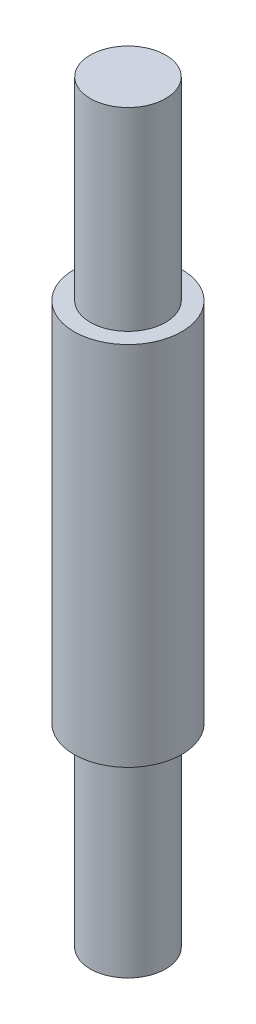
ISO-10303-21;
HEADER;
FILE_DESCRIPTION(('STEP AP214'),'2;1');
FILE_NAME('part.step','',(''),(''),'','','');
FILE_SCHEMA(('AUTOMOTIVE_DESIGN { 1 0 10303 214 1 1 1 1 }'));
ENDSEC;
DATA;
#1=APPLICATION_CONTEXT('core data for automotive mechanical design processes');
#2=APPLICATION_PROTOCOL_DEFINITION('international standard','automotive_design',2000,#1);
#3=PRODUCT_CONTEXT('',#1,'mechanical');
#4=PRODUCT('Part','Part','',(#3));
#5=PRODUCT_RELATED_PRODUCT_CATEGORY('part','',(#4));
#6=PRODUCT_DEFINITION_FORMATION('','',#4);
#7=PRODUCT_DEFINITION_CONTEXT('part definition',#1,'design');
#8=PRODUCT_DEFINITION('design','',#6,#7);
#9=PRODUCT_DEFINITION_SHAPE('','',#8);
#10=(LENGTH_UNIT() NAMED_UNIT(*) SI_UNIT(.MILLI.,.METRE.));
#11=(NAMED_UNIT(*) PLANE_ANGLE_UNIT() SI_UNIT($,.RADIAN.));
#12=(NAMED_UNIT(*) SI_UNIT($,.STERADIAN.) SOLID_ANGLE_UNIT());
#13=UNCERTAINTY_MEASURE_WITH_UNIT(LENGTH_MEASURE(1.E-05),#10,'distance_accuracy_value','');
#14=(GEOMETRIC_REPRESENTATION_CONTEXT(3) GLOBAL_UNCERTAINTY_ASSIGNED_CONTEXT((#13)) GLOBAL_UNIT_ASSIGNED_CONTEXT((#10,
#11,#12)) REPRESENTATION_CONTEXT('',''));
#15=CARTESIAN_POINT('',(0.,0.,0.));
#16=DIRECTION('',(0.,0.,1.));
#17=DIRECTION('',(1.,0.,0.));
#18=AXIS2_PLACEMENT_3D('',#15,#16,#17);
#19=CARTESIAN_POINT('',(-4.445,88.9,0.));
#20=DIRECTION('',(0.,1.,0.));
#21=DIRECTION('',(0.,0.,1.));
#22=AXIS2_PLACEMENT_3D('',#19,#20,#21);
#23=PLANE('',#22);
#24=CARTESIAN_POINT('',(0.,88.9,0.));
#25=DIRECTION('',(0.,1.,0.));
#26=DIRECTION('',(0.,0.,1.));
#27=AXIS2_PLACEMENT_3D('',#24,#25,#26);
#28=CIRCLE('',#27,4.445);
#29=CARTESIAN_POINT('',(0.,88.9,4.445));
#30=VERTEX_POINT('',#29);
#31=EDGE_CURVE('E10',#30,#30,#28,.T.);
#32=ORIENTED_EDGE('',*,*,#31,.T.);
#33=EDGE_LOOP('',(#32));
#34=FACE_BOUND('',#33,.T.);
#35=ADVANCED_FACE('F39',(#34),#23,.T.);
#36=CARTESIAN_POINT('',(0.,88.9,0.));
#37=DIRECTION('',(0.,1.,0.));
#38=DIRECTION('',(0.,0.,1.));
#39=AXIS2_PLACEMENT_3D('',#36,#37,#38);
#40=CYLINDRICAL_SURFACE('',#39,4.445);
#41=CARTESIAN_POINT('',(0.,66.04,0.));
#42=DIRECTION('',(0.,1.,0.));
#43=DIRECTION('',(0.,0.,1.));
#44=AXIS2_PLACEMENT_3D('',#41,#42,#43);
#45=CIRCLE('',#44,4.445);
#46=CARTESIAN_POINT('',(0.,66.04,4.445));
#47=VERTEX_POINT('',#46);
#48=EDGE_CURVE('E45',#47,#47,#45,.T.);
#49=ORIENTED_EDGE('',*,*,#48,.T.);
#50=EDGE_LOOP('',(#49));
#51=FACE_BOUND('',#50,.T.);
#52=ORIENTED_EDGE('',*,*,#31,.F.);
#53=EDGE_LOOP('',(#52));
#54=FACE_BOUND('',#53,.T.);
#55=ADVANCED_FACE('F77',(#51,#54),#40,.T.);
#56=CARTESIAN_POINT('',(-6.34999999999999,66.04,0.));
#57=DIRECTION('',(0.,1.,0.));
#58=DIRECTION('',(0.,0.,1.));
#59=AXIS2_PLACEMENT_3D('',#56,#57,#58);
#60=PLANE('',#59);
#61=CARTESIAN_POINT('',(0.,66.04,0.));
#62=DIRECTION('',(0.,1.,0.));
#63=DIRECTION('',(0.,0.,1.));
#64=AXIS2_PLACEMENT_3D('',#61,#62,#63);
#65=CIRCLE('',#64,6.34999999999999);
#66=CARTESIAN_POINT('',(0.,66.04,6.34999999999999));
#67=VERTEX_POINT('',#66);
#68=EDGE_CURVE('E49',#67,#67,#65,.T.);
#69=ORIENTED_EDGE('',*,*,#68,.T.);
#70=EDGE_LOOP('',(#69));
#71=FACE_BOUND('',#70,.T.);
#72=ORIENTED_EDGE('',*,*,#48,.F.);
#73=EDGE_LOOP('',(#72));
#74=FACE_BOUND('',#73,.T.);
#75=ADVANCED_FACE('F81',(#71,#74),#60,.T.);
#76=CARTESIAN_POINT('',(0.,88.9,0.));
#77=DIRECTION('',(0.,1.,0.));
#78=DIRECTION('',(0.,0.,1.));
#79=AXIS2_PLACEMENT_3D('',#76,#77,#78);
#80=CYLINDRICAL_SURFACE('',#79,6.34999999999999);
#81=CARTESIAN_POINT('',(0.,22.86,0.));
#82=DIRECTION('',(0.,1.,0.));
#83=DIRECTION('',(0.,0.,1.));
#84=AXIS2_PLACEMENT_3D('',#81,#82,#83);
#85=CIRCLE('',#84,6.34999999999999);
#86=CARTESIAN_POINT('',(0.,22.86,6.34999999999999));
#87=VERTEX_POINT('',#86);
#88=EDGE_CURVE('E53',#87,#87,#85,.T.);
#89=ORIENTED_EDGE('',*,*,#88,.T.);
#90=EDGE_LOOP('',(#89));
#91=FACE_BOUND('',#90,.T.);
#92=ORIENTED_EDGE('',*,*,#68,.F.);
#93=EDGE_LOOP('',(#92));
#94=FACE_BOUND('',#93,.T.);
#95=ADVANCED_FACE('F85',(#91,#94),#80,.T.);
#96=CARTESIAN_POINT('',(-4.445,22.86,0.));
#97=DIRECTION('',(0.,-1.,0.));
#98=DIRECTION('',(0.,0.,-1.));
#99=AXIS2_PLACEMENT_3D('',#96,#97,#98);
#100=PLANE('',#99);
#101=CARTESIAN_POINT('',(0.,22.86,0.));
#102=DIRECTION('',(0.,1.,0.));
#103=DIRECTION('',(0.,0.,1.));
#104=AXIS2_PLACEMENT_3D('',#101,#102,#103);
#105=CIRCLE('',#104,4.445);
#106=CARTESIAN_POINT('',(0.,22.86,4.445));
#107=VERTEX_POINT('',#106);
#108=EDGE_CURVE('E58',#107,#107,#105,.T.);
#109=ORIENTED_EDGE('',*,*,#108,.T.);
#110=EDGE_LOOP('',(#109));
#111=FACE_BOUND('',#110,.T.);
#112=ORIENTED_EDGE('',*,*,#88,.F.);
#113=EDGE_LOOP('',(#112));
#114=FACE_BOUND('',#113,.T.);
#115=ADVANCED_FACE('F74',(#111,#114),#100,.T.);
#116=CARTESIAN_POINT('',(0.,88.9,0.));
#117=DIRECTION('',(0.,1.,0.));
#118=DIRECTION('',(0.,0.,1.));
#119=AXIS2_PLACEMENT_3D('',#116,#117,#118);
#120=CYLINDRICAL_SURFACE('',#119,4.445);
#121=CARTESIAN_POINT('',(0.,0.,0.));
#122=DIRECTION('',(0.,1.,0.));
#123=DIRECTION('',(0.,0.,1.));
#124=AXIS2_PLACEMENT_3D('',#121,#122,#123);
#125=CIRCLE('',#124,4.445);
#126=CARTESIAN_POINT('',(0.,0.,4.445));
#127=VERTEX_POINT('',#126);
#128=EDGE_CURVE('E61',#127,#127,#125,.T.);
#129=ORIENTED_EDGE('',*,*,#128,.T.);
#130=EDGE_LOOP('',(#129));
#131=FACE_BOUND('',#130,.T.);
#132=ORIENTED_EDGE('',*,*,#108,.F.);
#133=EDGE_LOOP('',(#132));
#134=FACE_BOUND('',#133,.T.);
#135=ADVANCED_FACE('F65',(#131,#134),#120,.T.);
#136=CARTESIAN_POINT('',(-4.445,0.,0.));
#137=DIRECTION('',(0.,-1.,0.));
#138=DIRECTION('',(0.,0.,-1.));
#139=AXIS2_PLACEMENT_3D('',#136,#137,#138);
#140=PLANE('',#139);
#141=ORIENTED_EDGE('',*,*,#128,.F.);
#142=EDGE_LOOP('',(#141));
#143=FACE_BOUND('',#142,.T.);
#144=ADVANCED_FACE('F68',(#143),#140,.T.);
#145=CLOSED_SHELL('',(#35,#55,#75,#95,#115,#135,#144));
#146=MANIFOLD_SOLID_BREP('B2',#145);
#147=ADVANCED_BREP_SHAPE_REPRESENTATION('',(#18,#146),#14);
#148=SHAPE_DEFINITION_REPRESENTATION(#9,#147);
ENDSEC;
END-ISO-10303-21;
